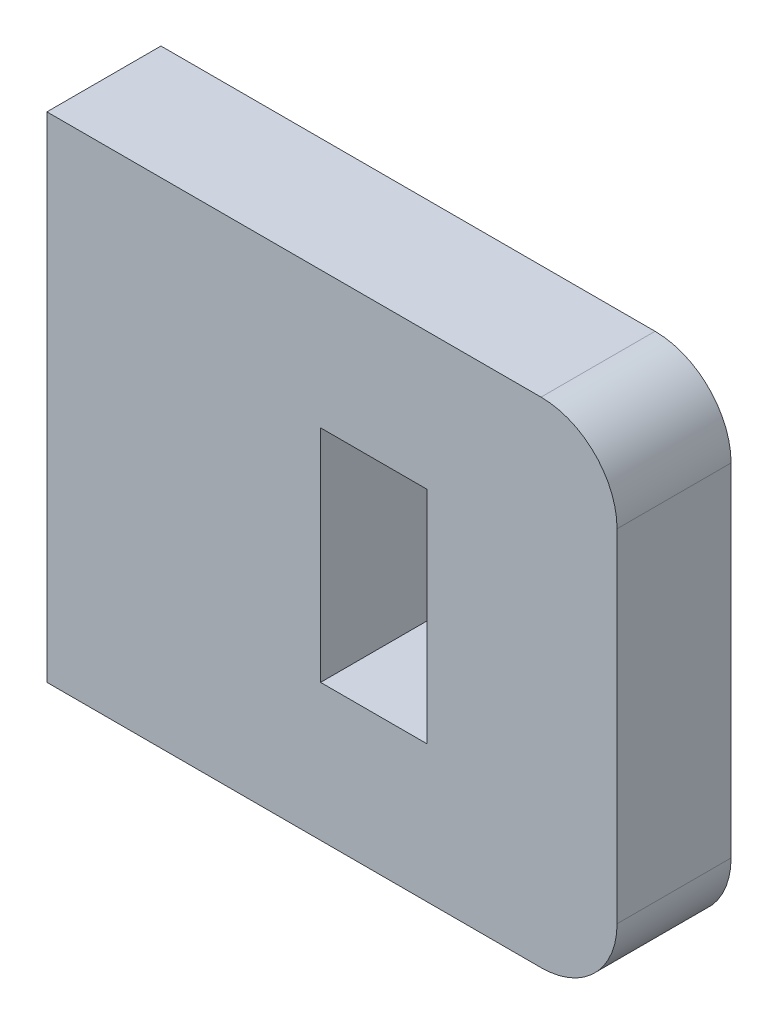
ISO-10303-21;
HEADER;
FILE_DESCRIPTION(('STEP AP214'),'2;1');
FILE_NAME('part.step','',(''),(''),'','','');
FILE_SCHEMA(('AUTOMOTIVE_DESIGN { 1 0 10303 214 1 1 1 1 }'));
ENDSEC;
DATA;
#1=APPLICATION_CONTEXT('core data for automotive mechanical design processes');
#2=APPLICATION_PROTOCOL_DEFINITION('international standard','automotive_design',2000,#1);
#3=PRODUCT_CONTEXT('',#1,'mechanical');
#4=PRODUCT('Part','Part','',(#3));
#5=PRODUCT_RELATED_PRODUCT_CATEGORY('part','',(#4));
#6=PRODUCT_DEFINITION_FORMATION('','',#4);
#7=PRODUCT_DEFINITION_CONTEXT('part definition',#1,'design');
#8=PRODUCT_DEFINITION('design','',#6,#7);
#9=PRODUCT_DEFINITION_SHAPE('','',#8);
#10=(LENGTH_UNIT() NAMED_UNIT(*) SI_UNIT(.MILLI.,.METRE.));
#11=(NAMED_UNIT(*) PLANE_ANGLE_UNIT() SI_UNIT($,.RADIAN.));
#12=(NAMED_UNIT(*) SI_UNIT($,.STERADIAN.) SOLID_ANGLE_UNIT());
#13=UNCERTAINTY_MEASURE_WITH_UNIT(LENGTH_MEASURE(1.E-05),#10,'distance_accuracy_value','');
#14=(GEOMETRIC_REPRESENTATION_CONTEXT(3) GLOBAL_UNCERTAINTY_ASSIGNED_CONTEXT((#13)) GLOBAL_UNIT_ASSIGNED_CONTEXT((#10,
#11,#12)) REPRESENTATION_CONTEXT('',''));
#15=CARTESIAN_POINT('',(0.,0.,0.));
#16=DIRECTION('',(0.,0.,1.));
#17=DIRECTION('',(1.,0.,0.));
#18=AXIS2_PLACEMENT_3D('',#15,#16,#17);
#19=CARTESIAN_POINT('',(0.,-6.5,1.5));
#20=DIRECTION('',(0.,1.,0.));
#21=DIRECTION('',(0.,0.,1.));
#22=AXIS2_PLACEMENT_3D('',#19,#20,#21);
#23=PLANE('',#22);
#24=DIRECTION('',(1.,0.,0.));
#25=VECTOR('',#24,1.);
#26=CARTESIAN_POINT('',(0.,-6.5,-1.5));
#27=LINE('',#26,#25);
#28=CARTESIAN_POINT('',(-4.5,-6.5,-1.5));
#29=VERTEX_POINT('',#28);
#30=CARTESIAN_POINT('',(8.49999999999999,-6.5,-1.5));
#31=VERTEX_POINT('',#30);
#32=EDGE_CURVE('E166',#29,#31,#27,.T.);
#33=ORIENTED_EDGE('',*,*,#32,.T.);
#34=DIRECTION('',(0.,0.,-1.));
#35=VECTOR('',#34,1.);
#36=CARTESIAN_POINT('',(8.49999999999999,-6.5,1.5));
#37=LINE('',#36,#35);
#38=CARTESIAN_POINT('',(8.49999999999999,-6.5,1.5));
#39=VERTEX_POINT('',#38);
#40=EDGE_CURVE('E11',#31,#39,#37,.F.);
#41=ORIENTED_EDGE('',*,*,#40,.T.);
#42=DIRECTION('',(1.,0.,0.));
#43=VECTOR('',#42,1.);
#44=CARTESIAN_POINT('',(0.,-6.5,1.5));
#45=LINE('',#44,#43);
#46=CARTESIAN_POINT('',(-4.5,-6.5,1.5));
#47=VERTEX_POINT('',#46);
#48=EDGE_CURVE('E147',#47,#39,#45,.T.);
#49=ORIENTED_EDGE('',*,*,#48,.F.);
#50=DIRECTION('',(0.,0.,-1.));
#51=VECTOR('',#50,1.);
#52=CARTESIAN_POINT('',(-4.5,-6.5,1.5));
#53=LINE('',#52,#51);
#54=EDGE_CURVE('E127',#47,#29,#53,.T.);
#55=ORIENTED_EDGE('',*,*,#54,.T.);
#56=EDGE_LOOP('',(#33,#41,#49,#55));
#57=FACE_BOUND('',#56,.T.);
#58=ADVANCED_FACE('F38',(#57),#23,.F.);
#59=CARTESIAN_POINT('',(10.5,0.,1.5));
#60=DIRECTION('',(-1.,0.,0.));
#61=DIRECTION('',(0.,0.,1.));
#62=AXIS2_PLACEMENT_3D('',#59,#60,#61);
#63=PLANE('',#62);
#64=DIRECTION('',(0.,1.,0.));
#65=VECTOR('',#64,1.);
#66=CARTESIAN_POINT('',(10.5,0.,-1.5));
#67=LINE('',#66,#65);
#68=CARTESIAN_POINT('',(10.5,-4.5,-1.5));
#69=VERTEX_POINT('',#68);
#70=CARTESIAN_POINT('',(10.5,4.5,-1.5));
#71=VERTEX_POINT('',#70);
#72=EDGE_CURVE('E168',#69,#71,#67,.T.);
#73=ORIENTED_EDGE('',*,*,#72,.T.);
#74=DIRECTION('',(0.,0.,-1.));
#75=VECTOR('',#74,1.);
#76=CARTESIAN_POINT('',(10.5,4.5,1.5));
#77=LINE('',#76,#75);
#78=CARTESIAN_POINT('',(10.5,4.5,1.5));
#79=VERTEX_POINT('',#78);
#80=EDGE_CURVE('E59',#71,#79,#77,.F.);
#81=ORIENTED_EDGE('',*,*,#80,.T.);
#82=DIRECTION('',(0.,1.,0.));
#83=VECTOR('',#82,1.);
#84=CARTESIAN_POINT('',(10.5,0.,1.5));
#85=LINE('',#84,#83);
#86=CARTESIAN_POINT('',(10.5,-4.5,1.5));
#87=VERTEX_POINT('',#86);
#88=EDGE_CURVE('E149',#87,#79,#85,.T.);
#89=ORIENTED_EDGE('',*,*,#88,.F.);
#90=DIRECTION('',(0.,0.,-1.));
#91=VECTOR('',#90,1.);
#92=CARTESIAN_POINT('',(10.5,-4.5,1.5));
#93=LINE('',#92,#91);
#94=EDGE_CURVE('E190',#87,#69,#93,.T.);
#95=ORIENTED_EDGE('',*,*,#94,.T.);
#96=EDGE_LOOP('',(#73,#81,#89,#95));
#97=FACE_BOUND('',#96,.T.);
#98=ADVANCED_FACE('F207',(#97),#63,.F.);
#99=CARTESIAN_POINT('',(0.,6.5,1.5));
#100=DIRECTION('',(0.,1.,0.));
#101=DIRECTION('',(0.,0.,1.));
#102=AXIS2_PLACEMENT_3D('',#99,#100,#101);
#103=PLANE('',#102);
#104=DIRECTION('',(1.,0.,0.));
#105=VECTOR('',#104,1.);
#106=CARTESIAN_POINT('',(0.,6.5,1.5));
#107=LINE('',#106,#105);
#108=CARTESIAN_POINT('',(-4.5,6.5,1.5));
#109=VERTEX_POINT('',#108);
#110=CARTESIAN_POINT('',(8.49999999999999,6.5,1.5));
#111=VERTEX_POINT('',#110);
#112=EDGE_CURVE('E151',#109,#111,#107,.T.);
#113=ORIENTED_EDGE('',*,*,#112,.T.);
#114=DIRECTION('',(0.,0.,-1.));
#115=VECTOR('',#114,1.);
#116=CARTESIAN_POINT('',(8.49999999999999,6.5,-1.5));
#117=LINE('',#116,#115);
#118=CARTESIAN_POINT('',(8.49999999999999,6.5,-1.5));
#119=VERTEX_POINT('',#118);
#120=EDGE_CURVE('E178',#111,#119,#117,.T.);
#121=ORIENTED_EDGE('',*,*,#120,.T.);
#122=DIRECTION('',(1.,0.,0.));
#123=VECTOR('',#122,1.);
#124=CARTESIAN_POINT('',(0.,6.5,-1.5));
#125=LINE('',#124,#123);
#126=CARTESIAN_POINT('',(-4.5,6.5,-1.5));
#127=VERTEX_POINT('',#126);
#128=EDGE_CURVE('E170',#127,#119,#125,.T.);
#129=ORIENTED_EDGE('',*,*,#128,.F.);
#130=DIRECTION('',(0.,0.,-1.));
#131=VECTOR('',#130,1.);
#132=CARTESIAN_POINT('',(-4.5,6.5,1.5));
#133=LINE('',#132,#131);
#134=EDGE_CURVE('E176',#109,#127,#133,.T.);
#135=ORIENTED_EDGE('',*,*,#134,.F.);
#136=EDGE_LOOP('',(#113,#121,#129,#135));
#137=FACE_BOUND('',#136,.T.);
#138=ADVANCED_FACE('F201',(#137),#103,.T.);
#139=CARTESIAN_POINT('',(5.5,0.,1.5));
#140=DIRECTION('',(-1.,0.,0.));
#141=DIRECTION('',(0.,0.,1.));
#142=AXIS2_PLACEMENT_3D('',#139,#140,#141);
#143=PLANE('',#142);
#144=DIRECTION('',(0.,1.,0.));
#145=VECTOR('',#144,1.);
#146=CARTESIAN_POINT('',(5.5,0.,-1.5));
#147=LINE('',#146,#145);
#148=CARTESIAN_POINT('',(5.5,-2.9,-1.5));
#149=VERTEX_POINT('',#148);
#150=CARTESIAN_POINT('',(5.5,2.9,-1.5));
#151=VERTEX_POINT('',#150);
#152=EDGE_CURVE('E122',#149,#151,#147,.T.);
#153=ORIENTED_EDGE('',*,*,#152,.F.);
#154=DIRECTION('',(0.,0.,-1.));
#155=VECTOR('',#154,1.);
#156=CARTESIAN_POINT('',(5.5,-2.9,1.5));
#157=LINE('',#156,#155);
#158=CARTESIAN_POINT('',(5.5,-2.9,1.5));
#159=VERTEX_POINT('',#158);
#160=EDGE_CURVE('E117',#159,#149,#157,.T.);
#161=ORIENTED_EDGE('',*,*,#160,.F.);
#162=DIRECTION('',(0.,1.,0.));
#163=VECTOR('',#162,1.);
#164=CARTESIAN_POINT('',(5.5,0.,1.5));
#165=LINE('',#164,#163);
#166=CARTESIAN_POINT('',(5.5,2.9,1.5));
#167=VERTEX_POINT('',#166);
#168=EDGE_CURVE('E120',#159,#167,#165,.T.);
#169=ORIENTED_EDGE('',*,*,#168,.T.);
#170=DIRECTION('',(0.,0.,-1.));
#171=VECTOR('',#170,1.);
#172=CARTESIAN_POINT('',(5.5,2.9,1.5));
#173=LINE('',#172,#171);
#174=EDGE_CURVE('E157',#167,#151,#173,.T.);
#175=ORIENTED_EDGE('',*,*,#174,.T.);
#176=EDGE_LOOP('',(#153,#161,#169,#175));
#177=FACE_BOUND('',#176,.T.);
#178=ADVANCED_FACE('F119',(#177),#143,.T.);
#179=CARTESIAN_POINT('',(0.,-2.9,1.5));
#180=DIRECTION('',(0.,1.,0.));
#181=DIRECTION('',(0.,0.,1.));
#182=AXIS2_PLACEMENT_3D('',#179,#180,#181);
#183=PLANE('',#182);
#184=DIRECTION('',(1.,0.,0.));
#185=VECTOR('',#184,1.);
#186=CARTESIAN_POINT('',(0.,-2.9,-1.5));
#187=LINE('',#186,#185);
#188=CARTESIAN_POINT('',(2.7,-2.9,-1.5));
#189=VERTEX_POINT('',#188);
#190=EDGE_CURVE('E159',#189,#149,#187,.T.);
#191=ORIENTED_EDGE('',*,*,#190,.F.);
#192=DIRECTION('',(0.,0.,-1.));
#193=VECTOR('',#192,1.);
#194=CARTESIAN_POINT('',(2.7,-2.9,1.5));
#195=LINE('',#194,#193);
#196=CARTESIAN_POINT('',(2.7,-2.9,1.5));
#197=VERTEX_POINT('',#196);
#198=EDGE_CURVE('E128',#197,#189,#195,.T.);
#199=ORIENTED_EDGE('',*,*,#198,.F.);
#200=DIRECTION('',(1.,0.,0.));
#201=VECTOR('',#200,1.);
#202=CARTESIAN_POINT('',(0.,-2.9,1.5));
#203=LINE('',#202,#201);
#204=EDGE_CURVE('E134',#197,#159,#203,.T.);
#205=ORIENTED_EDGE('',*,*,#204,.T.);
#206=ORIENTED_EDGE('',*,*,#160,.T.);
#207=EDGE_LOOP('',(#191,#199,#205,#206));
#208=FACE_BOUND('',#207,.T.);
#209=ADVANCED_FACE('F140',(#208),#183,.T.);
#210=CARTESIAN_POINT('',(2.7,0.,1.5));
#211=DIRECTION('',(-1.,0.,0.));
#212=DIRECTION('',(0.,0.,1.));
#213=AXIS2_PLACEMENT_3D('',#210,#211,#212);
#214=PLANE('',#213);
#215=DIRECTION('',(0.,1.,0.));
#216=VECTOR('',#215,1.);
#217=CARTESIAN_POINT('',(2.7,0.,-1.5));
#218=LINE('',#217,#216);
#219=CARTESIAN_POINT('',(2.7,2.9,-1.5));
#220=VERTEX_POINT('',#219);
#221=EDGE_CURVE('E161',#189,#220,#218,.T.);
#222=ORIENTED_EDGE('',*,*,#221,.T.);
#223=DIRECTION('',(0.,0.,-1.));
#224=VECTOR('',#223,1.);
#225=CARTESIAN_POINT('',(2.7,2.9,1.5));
#226=LINE('',#225,#224);
#227=CARTESIAN_POINT('',(2.7,2.9,1.5));
#228=VERTEX_POINT('',#227);
#229=EDGE_CURVE('E180',#228,#220,#226,.T.);
#230=ORIENTED_EDGE('',*,*,#229,.F.);
#231=DIRECTION('',(0.,1.,0.));
#232=VECTOR('',#231,1.);
#233=CARTESIAN_POINT('',(2.7,0.,1.5));
#234=LINE('',#233,#232);
#235=EDGE_CURVE('E142',#197,#228,#234,.T.);
#236=ORIENTED_EDGE('',*,*,#235,.F.);
#237=ORIENTED_EDGE('',*,*,#198,.T.);
#238=EDGE_LOOP('',(#222,#230,#236,#237));
#239=FACE_BOUND('',#238,.T.);
#240=ADVANCED_FACE('F223',(#239),#214,.F.);
#241=CARTESIAN_POINT('',(0.,2.9,1.5));
#242=DIRECTION('',(0.,1.,0.));
#243=DIRECTION('',(0.,0.,1.));
#244=AXIS2_PLACEMENT_3D('',#241,#242,#243);
#245=PLANE('',#244);
#246=DIRECTION('',(1.,0.,0.));
#247=VECTOR('',#246,1.);
#248=CARTESIAN_POINT('',(0.,2.9,-1.5));
#249=LINE('',#248,#247);
#250=EDGE_CURVE('E163',#220,#151,#249,.T.);
#251=ORIENTED_EDGE('',*,*,#250,.T.);
#252=ORIENTED_EDGE('',*,*,#174,.F.);
#253=DIRECTION('',(1.,0.,0.));
#254=VECTOR('',#253,1.);
#255=CARTESIAN_POINT('',(0.,2.9,1.5));
#256=LINE('',#255,#254);
#257=EDGE_CURVE('E136',#228,#167,#256,.T.);
#258=ORIENTED_EDGE('',*,*,#257,.F.);
#259=ORIENTED_EDGE('',*,*,#229,.T.);
#260=EDGE_LOOP('',(#251,#252,#258,#259));
#261=FACE_BOUND('',#260,.T.);
#262=ADVANCED_FACE('F216',(#261),#245,.F.);
#263=CARTESIAN_POINT('',(-4.5,0.,1.5));
#264=DIRECTION('',(-1.,0.,0.));
#265=DIRECTION('',(0.,-1.,0.));
#266=AXIS2_PLACEMENT_3D('',#263,#264,#265);
#267=PLANE('',#266);
#268=DIRECTION('',(0.,1.,0.));
#269=VECTOR('',#268,1.);
#270=CARTESIAN_POINT('',(-4.5,0.,-1.5));
#271=LINE('',#270,#269);
#272=EDGE_CURVE('E138',#29,#127,#271,.T.);
#273=ORIENTED_EDGE('',*,*,#272,.F.);
#274=ORIENTED_EDGE('',*,*,#54,.F.);
#275=DIRECTION('',(0.,1.,0.));
#276=VECTOR('',#275,1.);
#277=CARTESIAN_POINT('',(-4.5,0.,1.5));
#278=LINE('',#277,#276);
#279=EDGE_CURVE('E154',#47,#109,#278,.T.);
#280=ORIENTED_EDGE('',*,*,#279,.T.);
#281=ORIENTED_EDGE('',*,*,#134,.T.);
#282=EDGE_LOOP('',(#273,#274,#280,#281));
#283=FACE_BOUND('',#282,.T.);
#284=ADVANCED_FACE('F214',(#283),#267,.T.);
#285=CARTESIAN_POINT('',(0.,0.,1.5));
#286=DIRECTION('',(0.,0.,1.));
#287=DIRECTION('',(1.,0.,0.));
#288=AXIS2_PLACEMENT_3D('',#285,#286,#287);
#289=PLANE('',#288);
#290=ORIENTED_EDGE('',*,*,#168,.F.);
#291=ORIENTED_EDGE('',*,*,#204,.F.);
#292=ORIENTED_EDGE('',*,*,#235,.T.);
#293=ORIENTED_EDGE('',*,*,#257,.T.);
#294=EDGE_LOOP('',(#290,#291,#292,#293));
#295=FACE_BOUND('',#294,.T.);
#296=ORIENTED_EDGE('',*,*,#88,.T.);
#297=CARTESIAN_POINT('',(8.49999999999999,4.5,1.5));
#298=DIRECTION('',(0.,0.,1.));
#299=DIRECTION('',(1.,0.,0.));
#300=AXIS2_PLACEMENT_3D('',#297,#298,#299);
#301=CIRCLE('',#300,2.);
#302=EDGE_CURVE('E46',#79,#111,#301,.T.);
#303=ORIENTED_EDGE('',*,*,#302,.T.);
#304=ORIENTED_EDGE('',*,*,#112,.F.);
#305=ORIENTED_EDGE('',*,*,#279,.F.);
#306=ORIENTED_EDGE('',*,*,#48,.T.);
#307=CARTESIAN_POINT('',(8.49999999999999,-4.5,1.5));
#308=DIRECTION('',(0.,0.,1.));
#309=DIRECTION('',(1.,0.,0.));
#310=AXIS2_PLACEMENT_3D('',#307,#308,#309);
#311=CIRCLE('',#310,2.);
#312=EDGE_CURVE('E194',#39,#87,#311,.T.);
#313=ORIENTED_EDGE('',*,*,#312,.T.);
#314=EDGE_LOOP('',(#296,#303,#304,#305,#306,#313));
#315=FACE_BOUND('',#314,.T.);
#316=ADVANCED_FACE('F132',(#295,#315),#289,.T.);
#317=CARTESIAN_POINT('',(0.,0.,-1.5));
#318=DIRECTION('',(0.,0.,1.));
#319=DIRECTION('',(1.,0.,0.));
#320=AXIS2_PLACEMENT_3D('',#317,#318,#319);
#321=PLANE('',#320);
#322=ORIENTED_EDGE('',*,*,#152,.T.);
#323=ORIENTED_EDGE('',*,*,#250,.F.);
#324=ORIENTED_EDGE('',*,*,#221,.F.);
#325=ORIENTED_EDGE('',*,*,#190,.T.);
#326=EDGE_LOOP('',(#322,#323,#324,#325));
#327=FACE_BOUND('',#326,.T.);
#328=ORIENTED_EDGE('',*,*,#128,.T.);
#329=CARTESIAN_POINT('',(8.49999999999999,4.5,-1.5));
#330=DIRECTION('',(0.,0.,1.));
#331=DIRECTION('',(1.,0.,0.));
#332=AXIS2_PLACEMENT_3D('',#329,#330,#331);
#333=CIRCLE('',#332,2.);
#334=EDGE_CURVE('E188',#119,#71,#333,.F.);
#335=ORIENTED_EDGE('',*,*,#334,.T.);
#336=ORIENTED_EDGE('',*,*,#72,.F.);
#337=CARTESIAN_POINT('',(8.49999999999999,-4.5,-1.5));
#338=DIRECTION('',(0.,0.,1.));
#339=DIRECTION('',(1.,0.,0.));
#340=AXIS2_PLACEMENT_3D('',#337,#338,#339);
#341=CIRCLE('',#340,2.);
#342=EDGE_CURVE('E186',#69,#31,#341,.F.);
#343=ORIENTED_EDGE('',*,*,#342,.T.);
#344=ORIENTED_EDGE('',*,*,#32,.F.);
#345=ORIENTED_EDGE('',*,*,#272,.T.);
#346=EDGE_LOOP('',(#328,#335,#336,#343,#344,#345));
#347=FACE_BOUND('',#346,.T.);
#348=ADVANCED_FACE('F206',(#327,#347),#321,.F.);
#349=CARTESIAN_POINT('',(8.49999999999999,4.5,1.5));
#350=DIRECTION('',(0.,0.,1.));
#351=DIRECTION('',(1.,0.,0.));
#352=AXIS2_PLACEMENT_3D('',#349,#350,#351);
#353=CYLINDRICAL_SURFACE('',#352,2.);
#354=ORIENTED_EDGE('',*,*,#302,.F.);
#355=ORIENTED_EDGE('',*,*,#80,.F.);
#356=ORIENTED_EDGE('',*,*,#334,.F.);
#357=ORIENTED_EDGE('',*,*,#120,.F.);
#358=EDGE_LOOP('',(#354,#355,#356,#357));
#359=FACE_BOUND('',#358,.T.);
#360=ADVANCED_FACE('F203',(#359),#353,.T.);
#361=CARTESIAN_POINT('',(8.49999999999999,-4.5,1.5));
#362=DIRECTION('',(0.,0.,-1.));
#363=DIRECTION('',(-1.,0.,0.));
#364=AXIS2_PLACEMENT_3D('',#361,#362,#363);
#365=CYLINDRICAL_SURFACE('',#364,2.);
#366=ORIENTED_EDGE('',*,*,#312,.F.);
#367=ORIENTED_EDGE('',*,*,#40,.F.);
#368=ORIENTED_EDGE('',*,*,#342,.F.);
#369=ORIENTED_EDGE('',*,*,#94,.F.);
#370=EDGE_LOOP('',(#366,#367,#368,#369));
#371=FACE_BOUND('',#370,.T.);
#372=ADVANCED_FACE('F40',(#371),#365,.T.);
#373=CLOSED_SHELL('',(#58,#98,#138,#178,#209,#240,#262,#284,#316,#348,#360,#372));
#374=MANIFOLD_SOLID_BREP('B2',#373);
#375=ADVANCED_BREP_SHAPE_REPRESENTATION('',(#18,#374),#14);
#376=SHAPE_DEFINITION_REPRESENTATION(#9,#375);
ENDSEC;
END-ISO-10303-21;
